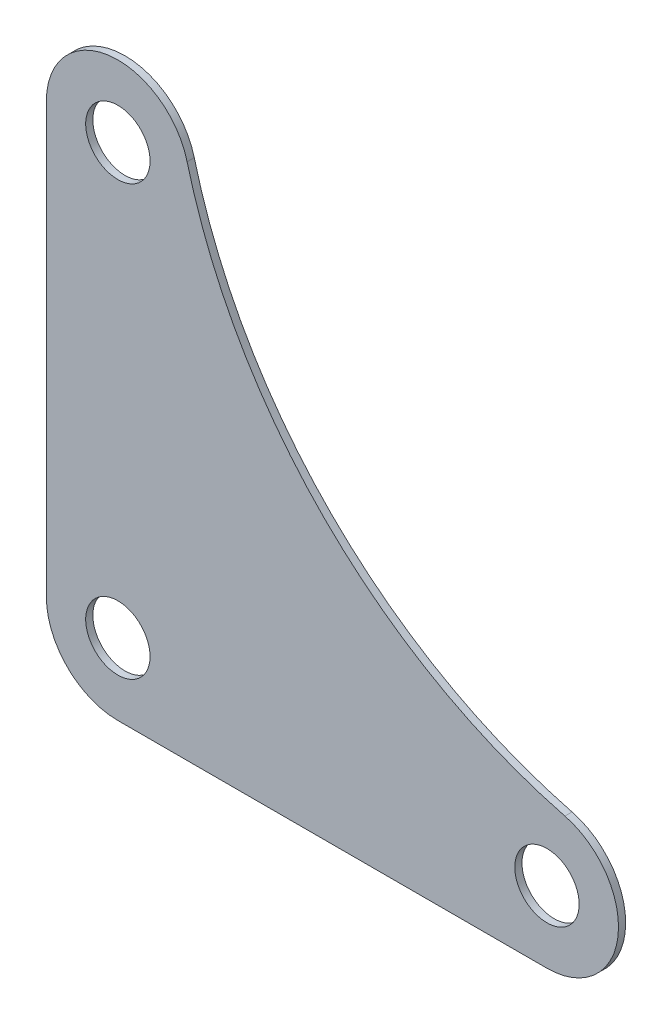
ISO-10303-21;
HEADER;
FILE_DESCRIPTION(('STEP AP214'),'2;1');
FILE_NAME('part.step','',(''),(''),'','','');
FILE_SCHEMA(('AUTOMOTIVE_DESIGN { 1 0 10303 214 1 1 1 1 }'));
ENDSEC;
DATA;
#1=APPLICATION_CONTEXT('core data for automotive mechanical design processes');
#2=APPLICATION_PROTOCOL_DEFINITION('international standard','automotive_design',2000,#1);
#3=PRODUCT_CONTEXT('',#1,'mechanical');
#4=PRODUCT('Part','Part','',(#3));
#5=PRODUCT_RELATED_PRODUCT_CATEGORY('part','',(#4));
#6=PRODUCT_DEFINITION_FORMATION('','',#4);
#7=PRODUCT_DEFINITION_CONTEXT('part definition',#1,'design');
#8=PRODUCT_DEFINITION('design','',#6,#7);
#9=PRODUCT_DEFINITION_SHAPE('','',#8);
#10=(LENGTH_UNIT() NAMED_UNIT(*) SI_UNIT(.MILLI.,.METRE.));
#11=(NAMED_UNIT(*) PLANE_ANGLE_UNIT() SI_UNIT($,.RADIAN.));
#12=(NAMED_UNIT(*) SI_UNIT($,.STERADIAN.) SOLID_ANGLE_UNIT());
#13=UNCERTAINTY_MEASURE_WITH_UNIT(LENGTH_MEASURE(1.E-05),#10,'distance_accuracy_value','');
#14=(GEOMETRIC_REPRESENTATION_CONTEXT(3) GLOBAL_UNCERTAINTY_ASSIGNED_CONTEXT((#13)) GLOBAL_UNIT_ASSIGNED_CONTEXT((#10,
#11,#12)) REPRESENTATION_CONTEXT('',''));
#15=CARTESIAN_POINT('',(0.,0.,0.));
#16=DIRECTION('',(0.,0.,1.));
#17=DIRECTION('',(1.,0.,0.));
#18=AXIS2_PLACEMENT_3D('',#15,#16,#17);
#19=CARTESIAN_POINT('',(0.,0.,1.));
#20=DIRECTION('',(1.,0.,0.));
#21=DIRECTION('',(0.,0.,-1.));
#22=AXIS2_PLACEMENT_3D('',#19,#20,#21);
#23=PLANE('',#22);
#24=DIRECTION('',(0.,-1.,0.));
#25=VECTOR('',#24,1.);
#26=CARTESIAN_POINT('',(0.,0.,0.));
#27=LINE('',#26,#25);
#28=CARTESIAN_POINT('',(0.,70.,0.));
#29=VERTEX_POINT('',#28);
#30=CARTESIAN_POINT('',(0.,10.,0.));
#31=VERTEX_POINT('',#30);
#32=EDGE_CURVE('E133',#29,#31,#27,.T.);
#33=ORIENTED_EDGE('',*,*,#32,.T.);
#34=DIRECTION('',(0.,0.,-1.));
#35=VECTOR('',#34,1.);
#36=CARTESIAN_POINT('',(0.,10.,1.));
#37=LINE('',#36,#35);
#38=CARTESIAN_POINT('',(0.,10.,1.));
#39=VERTEX_POINT('',#38);
#40=EDGE_CURVE('E51',#31,#39,#37,.F.);
#41=ORIENTED_EDGE('',*,*,#40,.T.);
#42=DIRECTION('',(0.,-1.,0.));
#43=VECTOR('',#42,1.);
#44=CARTESIAN_POINT('',(0.,0.,1.));
#45=LINE('',#44,#43);
#46=CARTESIAN_POINT('',(0.,70.,1.));
#47=VERTEX_POINT('',#46);
#48=EDGE_CURVE('E107',#47,#39,#45,.T.);
#49=ORIENTED_EDGE('',*,*,#48,.F.);
#50=DIRECTION('',(0.,0.,-1.));
#51=VECTOR('',#50,1.);
#52=CARTESIAN_POINT('',(0.,70.,1.));
#53=LINE('',#52,#51);
#54=EDGE_CURVE('E132',#47,#29,#53,.T.);
#55=ORIENTED_EDGE('',*,*,#54,.T.);
#56=EDGE_LOOP('',(#33,#41,#49,#55));
#57=FACE_BOUND('',#56,.T.);
#58=ADVANCED_FACE('F41',(#57),#23,.F.);
#59=CARTESIAN_POINT('',(0.,0.,1.));
#60=DIRECTION('',(0.,1.,0.));
#61=DIRECTION('',(0.,0.,1.));
#62=AXIS2_PLACEMENT_3D('',#59,#60,#61);
#63=PLANE('',#62);
#64=DIRECTION('',(1.,0.,0.));
#65=VECTOR('',#64,1.);
#66=CARTESIAN_POINT('',(0.,0.,1.));
#67=LINE('',#66,#65);
#68=CARTESIAN_POINT('',(10.,0.,1.));
#69=VERTEX_POINT('',#68);
#70=CARTESIAN_POINT('',(70.,0.,1.));
#71=VERTEX_POINT('',#70);
#72=EDGE_CURVE('E96',#69,#71,#67,.T.);
#73=ORIENTED_EDGE('',*,*,#72,.F.);
#74=DIRECTION('',(0.,0.,-1.));
#75=VECTOR('',#74,1.);
#76=CARTESIAN_POINT('',(10.,0.,1.));
#77=LINE('',#76,#75);
#78=CARTESIAN_POINT('',(10.,0.,0.));
#79=VERTEX_POINT('',#78);
#80=EDGE_CURVE('E116',#69,#79,#77,.T.);
#81=ORIENTED_EDGE('',*,*,#80,.T.);
#82=DIRECTION('',(1.,0.,0.));
#83=VECTOR('',#82,1.);
#84=CARTESIAN_POINT('',(0.,0.,0.));
#85=LINE('',#84,#83);
#86=CARTESIAN_POINT('',(70.,0.,0.));
#87=VERTEX_POINT('',#86);
#88=EDGE_CURVE('E112',#79,#87,#85,.T.);
#89=ORIENTED_EDGE('',*,*,#88,.T.);
#90=DIRECTION('',(0.,0.,-1.));
#91=VECTOR('',#90,1.);
#92=CARTESIAN_POINT('',(70.,0.,1.));
#93=LINE('',#92,#91);
#94=EDGE_CURVE('E110',#71,#87,#93,.T.);
#95=ORIENTED_EDGE('',*,*,#94,.F.);
#96=EDGE_LOOP('',(#73,#81,#89,#95));
#97=FACE_BOUND('',#96,.T.);
#98=ADVANCED_FACE('F111',(#97),#63,.F.);
#99=CARTESIAN_POINT('',(70.,10.,1.));
#100=DIRECTION('',(0.,0.,-1.));
#101=DIRECTION('',(-1.,0.,0.));
#102=AXIS2_PLACEMENT_3D('',#99,#100,#101);
#103=CYLINDRICAL_SURFACE('',#102,10.);
#104=CARTESIAN_POINT('',(70.,10.,0.));
#105=DIRECTION('',(0.,0.,1.));
#106=DIRECTION('',(1.,0.,0.));
#107=AXIS2_PLACEMENT_3D('',#104,#105,#106);
#108=CIRCLE('',#107,10.);
#109=CARTESIAN_POINT('',(72.5030454099815,19.6816715331378,0.));
#110=VERTEX_POINT('',#109);
#111=EDGE_CURVE('E138',#87,#110,#108,.T.);
#112=ORIENTED_EDGE('',*,*,#111,.T.);
#113=DIRECTION('',(0.,0.,-1.));
#114=VECTOR('',#113,1.);
#115=CARTESIAN_POINT('',(72.5030454099815,19.6816715331378,1.));
#116=LINE('',#115,#114);
#117=CARTESIAN_POINT('',(72.5030454099815,19.6816715331378,1.));
#118=VERTEX_POINT('',#117);
#119=EDGE_CURVE('E117',#118,#110,#116,.T.);
#120=ORIENTED_EDGE('',*,*,#119,.F.);
#121=CARTESIAN_POINT('',(70.,10.,1.));
#122=DIRECTION('',(0.,0.,1.));
#123=DIRECTION('',(1.,0.,0.));
#124=AXIS2_PLACEMENT_3D('',#121,#122,#123);
#125=CIRCLE('',#124,10.);
#126=EDGE_CURVE('E100',#71,#118,#125,.T.);
#127=ORIENTED_EDGE('',*,*,#126,.F.);
#128=ORIENTED_EDGE('',*,*,#94,.T.);
#129=EDGE_LOOP('',(#112,#120,#127,#128));
#130=FACE_BOUND('',#129,.T.);
#131=ADVANCED_FACE('F119',(#130),#103,.T.);
#132=CARTESIAN_POINT('',(90.9208171622762,90.9208171622762,1.));
#133=DIRECTION('',(0.,0.,-1.));
#134=DIRECTION('',(-1.,0.,0.));
#135=AXIS2_PLACEMENT_3D('',#132,#133,#134);
#136=CYLINDRICAL_SURFACE('',#135,73.5814527329354);
#137=CARTESIAN_POINT('',(90.9208171622762,90.9208171622762,0.));
#138=DIRECTION('',(0.,0.,-1.));
#139=DIRECTION('',(1.,0.,0.));
#140=AXIS2_PLACEMENT_3D('',#137,#138,#139);
#141=CIRCLE('',#140,73.5814527329354);
#142=CARTESIAN_POINT('',(19.6816715331378,72.5030454099815,0.));
#143=VERTEX_POINT('',#142);
#144=EDGE_CURVE('E141',#110,#143,#141,.T.);
#145=ORIENTED_EDGE('',*,*,#144,.T.);
#146=DIRECTION('',(0.,0.,-1.));
#147=VECTOR('',#146,1.);
#148=CARTESIAN_POINT('',(19.6816715331378,72.5030454099815,1.));
#149=LINE('',#148,#147);
#150=CARTESIAN_POINT('',(19.6816715331378,72.5030454099815,1.));
#151=VERTEX_POINT('',#150);
#152=EDGE_CURVE('E150',#151,#143,#149,.T.);
#153=ORIENTED_EDGE('',*,*,#152,.F.);
#154=CARTESIAN_POINT('',(90.9208171622762,90.9208171622762,1.));
#155=DIRECTION('',(0.,0.,-1.));
#156=DIRECTION('',(1.,0.,0.));
#157=AXIS2_PLACEMENT_3D('',#154,#155,#156);
#158=CIRCLE('',#157,73.5814527329354);
#159=EDGE_CURVE('E123',#118,#151,#158,.T.);
#160=ORIENTED_EDGE('',*,*,#159,.F.);
#161=ORIENTED_EDGE('',*,*,#119,.T.);
#162=EDGE_LOOP('',(#145,#153,#160,#161));
#163=FACE_BOUND('',#162,.T.);
#164=ADVANCED_FACE('F198',(#163),#136,.F.);
#165=CARTESIAN_POINT('',(10.,70.,1.));
#166=DIRECTION('',(0.,0.,-1.));
#167=DIRECTION('',(-1.,0.,0.));
#168=AXIS2_PLACEMENT_3D('',#165,#166,#167);
#169=CYLINDRICAL_SURFACE('',#168,10.);
#170=CARTESIAN_POINT('',(10.,70.,0.));
#171=DIRECTION('',(0.,0.,1.));
#172=DIRECTION('',(1.,0.,0.));
#173=AXIS2_PLACEMENT_3D('',#170,#171,#172);
#174=CIRCLE('',#173,10.);
#175=EDGE_CURVE('E144',#143,#29,#174,.T.);
#176=ORIENTED_EDGE('',*,*,#175,.T.);
#177=ORIENTED_EDGE('',*,*,#54,.F.);
#178=CARTESIAN_POINT('',(10.,70.,1.));
#179=DIRECTION('',(0.,0.,1.));
#180=DIRECTION('',(1.,0.,0.));
#181=AXIS2_PLACEMENT_3D('',#178,#179,#180);
#182=CIRCLE('',#181,10.);
#183=EDGE_CURVE('E126',#151,#47,#182,.T.);
#184=ORIENTED_EDGE('',*,*,#183,.F.);
#185=ORIENTED_EDGE('',*,*,#152,.T.);
#186=EDGE_LOOP('',(#176,#177,#184,#185));
#187=FACE_BOUND('',#186,.T.);
#188=ADVANCED_FACE('F201',(#187),#169,.T.);
#189=CARTESIAN_POINT('',(10.,70.,1.));
#190=DIRECTION('',(0.,0.,1.));
#191=DIRECTION('',(1.,0.,0.));
#192=AXIS2_PLACEMENT_3D('',#189,#190,#191);
#193=PLANE('',#192);
#194=CARTESIAN_POINT('',(10.,70.,1.));
#195=DIRECTION('',(0.,0.,1.));
#196=DIRECTION('',(1.,0.,0.));
#197=AXIS2_PLACEMENT_3D('',#194,#195,#196);
#198=CIRCLE('',#197,4.5);
#199=CARTESIAN_POINT('',(14.5,70.,1.));
#200=VERTEX_POINT('',#199);
#201=EDGE_CURVE('E231',#200,#200,#198,.T.);
#202=ORIENTED_EDGE('',*,*,#201,.F.);
#203=EDGE_LOOP('',(#202));
#204=FACE_BOUND('',#203,.T.);
#205=CARTESIAN_POINT('',(70.,10.,1.));
#206=DIRECTION('',(0.,0.,1.));
#207=DIRECTION('',(1.,0.,0.));
#208=AXIS2_PLACEMENT_3D('',#205,#206,#207);
#209=CIRCLE('',#208,4.5);
#210=CARTESIAN_POINT('',(74.5,10.,1.));
#211=VERTEX_POINT('',#210);
#212=EDGE_CURVE('E230',#211,#211,#209,.T.);
#213=ORIENTED_EDGE('',*,*,#212,.F.);
#214=EDGE_LOOP('',(#213));
#215=FACE_BOUND('',#214,.T.);
#216=CARTESIAN_POINT('',(10.,10.,1.));
#217=DIRECTION('',(0.,0.,1.));
#218=DIRECTION('',(1.,0.,0.));
#219=AXIS2_PLACEMENT_3D('',#216,#217,#218);
#220=CIRCLE('',#219,4.5);
#221=CARTESIAN_POINT('',(14.5,10.,1.));
#222=VERTEX_POINT('',#221);
#223=EDGE_CURVE('E166',#222,#222,#220,.T.);
#224=ORIENTED_EDGE('',*,*,#223,.F.);
#225=EDGE_LOOP('',(#224));
#226=FACE_BOUND('',#225,.T.);
#227=ORIENTED_EDGE('',*,*,#48,.T.);
#228=CARTESIAN_POINT('',(10.,10.,1.));
#229=DIRECTION('',(0.,0.,1.));
#230=DIRECTION('',(1.,0.,0.));
#231=AXIS2_PLACEMENT_3D('',#228,#229,#230);
#232=CIRCLE('',#231,10.);
#233=EDGE_CURVE('E11',#39,#69,#232,.T.);
#234=ORIENTED_EDGE('',*,*,#233,.T.);
#235=ORIENTED_EDGE('',*,*,#72,.T.);
#236=ORIENTED_EDGE('',*,*,#126,.T.);
#237=ORIENTED_EDGE('',*,*,#159,.T.);
#238=ORIENTED_EDGE('',*,*,#183,.T.);
#239=EDGE_LOOP('',(#227,#234,#235,#236,#237,#238));
#240=FACE_BOUND('',#239,.T.);
#241=ADVANCED_FACE('F98',(#204,#215,#226,#240),#193,.T.);
#242=CARTESIAN_POINT('',(10.,70.,0.));
#243=DIRECTION('',(0.,0.,1.));
#244=DIRECTION('',(1.,0.,0.));
#245=AXIS2_PLACEMENT_3D('',#242,#243,#244);
#246=PLANE('',#245);
#247=CARTESIAN_POINT('',(10.,70.,0.));
#248=DIRECTION('',(0.,0.,1.));
#249=DIRECTION('',(1.,0.,0.));
#250=AXIS2_PLACEMENT_3D('',#247,#248,#249);
#251=CIRCLE('',#250,4.5);
#252=CARTESIAN_POINT('',(14.5,70.,0.));
#253=VERTEX_POINT('',#252);
#254=EDGE_CURVE('E45',#253,#253,#251,.T.);
#255=ORIENTED_EDGE('',*,*,#254,.T.);
#256=EDGE_LOOP('',(#255));
#257=FACE_BOUND('',#256,.T.);
#258=CARTESIAN_POINT('',(70.,10.,0.));
#259=DIRECTION('',(0.,0.,1.));
#260=DIRECTION('',(1.,0.,0.));
#261=AXIS2_PLACEMENT_3D('',#258,#259,#260);
#262=CIRCLE('',#261,4.5);
#263=CARTESIAN_POINT('',(74.5,10.,0.));
#264=VERTEX_POINT('',#263);
#265=EDGE_CURVE('E165',#264,#264,#262,.T.);
#266=ORIENTED_EDGE('',*,*,#265,.T.);
#267=EDGE_LOOP('',(#266));
#268=FACE_BOUND('',#267,.T.);
#269=CARTESIAN_POINT('',(10.,10.,0.));
#270=DIRECTION('',(0.,0.,1.));
#271=DIRECTION('',(1.,0.,0.));
#272=AXIS2_PLACEMENT_3D('',#269,#270,#271);
#273=CIRCLE('',#272,4.5);
#274=CARTESIAN_POINT('',(14.5,10.,0.));
#275=VERTEX_POINT('',#274);
#276=EDGE_CURVE('E162',#275,#275,#273,.T.);
#277=ORIENTED_EDGE('',*,*,#276,.T.);
#278=EDGE_LOOP('',(#277));
#279=FACE_BOUND('',#278,.T.);
#280=ORIENTED_EDGE('',*,*,#88,.F.);
#281=CARTESIAN_POINT('',(10.,10.,0.));
#282=DIRECTION('',(0.,0.,1.));
#283=DIRECTION('',(1.,0.,0.));
#284=AXIS2_PLACEMENT_3D('',#281,#282,#283);
#285=CIRCLE('',#284,10.);
#286=EDGE_CURVE('E66',#79,#31,#285,.F.);
#287=ORIENTED_EDGE('',*,*,#286,.T.);
#288=ORIENTED_EDGE('',*,*,#32,.F.);
#289=ORIENTED_EDGE('',*,*,#175,.F.);
#290=ORIENTED_EDGE('',*,*,#144,.F.);
#291=ORIENTED_EDGE('',*,*,#111,.F.);
#292=EDGE_LOOP('',(#280,#287,#288,#289,#290,#291));
#293=FACE_BOUND('',#292,.T.);
#294=ADVANCED_FACE('F175',(#257,#268,#279,#293),#246,.F.);
#295=CARTESIAN_POINT('',(10.,10.,1.));
#296=DIRECTION('',(0.,0.,-1.));
#297=DIRECTION('',(-1.,0.,0.));
#298=AXIS2_PLACEMENT_3D('',#295,#296,#297);
#299=CYLINDRICAL_SURFACE('',#298,10.);
#300=ORIENTED_EDGE('',*,*,#233,.F.);
#301=ORIENTED_EDGE('',*,*,#40,.F.);
#302=ORIENTED_EDGE('',*,*,#286,.F.);
#303=ORIENTED_EDGE('',*,*,#80,.F.);
#304=EDGE_LOOP('',(#300,#301,#302,#303));
#305=FACE_BOUND('',#304,.T.);
#306=ADVANCED_FACE('F43',(#305),#299,.T.);
#307=CARTESIAN_POINT('',(10.,10.,-9.));
#308=DIRECTION('',(0.,0.,1.));
#309=DIRECTION('',(1.,0.,0.));
#310=AXIS2_PLACEMENT_3D('',#307,#308,#309);
#311=CYLINDRICAL_SURFACE('',#310,4.5);
#312=ORIENTED_EDGE('',*,*,#223,.T.);
#313=EDGE_LOOP('',(#312));
#314=FACE_BOUND('',#313,.T.);
#315=ORIENTED_EDGE('',*,*,#276,.F.);
#316=EDGE_LOOP('',(#315));
#317=FACE_BOUND('',#316,.T.);
#318=ADVANCED_FACE('F185',(#314,#317),#311,.F.);
#319=CARTESIAN_POINT('',(70.,10.,-9.));
#320=DIRECTION('',(0.,0.,1.));
#321=DIRECTION('',(1.,0.,0.));
#322=AXIS2_PLACEMENT_3D('',#319,#320,#321);
#323=CYLINDRICAL_SURFACE('',#322,4.5);
#324=ORIENTED_EDGE('',*,*,#212,.T.);
#325=EDGE_LOOP('',(#324));
#326=FACE_BOUND('',#325,.T.);
#327=ORIENTED_EDGE('',*,*,#265,.F.);
#328=EDGE_LOOP('',(#327));
#329=FACE_BOUND('',#328,.T.);
#330=ADVANCED_FACE('F179',(#326,#329),#323,.F.);
#331=CARTESIAN_POINT('',(10.,70.,-9.));
#332=DIRECTION('',(0.,0.,1.));
#333=DIRECTION('',(1.,0.,0.));
#334=AXIS2_PLACEMENT_3D('',#331,#332,#333);
#335=CYLINDRICAL_SURFACE('',#334,4.5);
#336=ORIENTED_EDGE('',*,*,#201,.T.);
#337=EDGE_LOOP('',(#336));
#338=FACE_BOUND('',#337,.T.);
#339=ORIENTED_EDGE('',*,*,#254,.F.);
#340=EDGE_LOOP('',(#339));
#341=FACE_BOUND('',#340,.T.);
#342=ADVANCED_FACE('F177',(#338,#341),#335,.F.);
#343=CLOSED_SHELL('',(#58,#98,#131,#164,#188,#241,#294,#306,#318,#330,#342));
#344=MANIFOLD_SOLID_BREP('B2',#343);
#345=ADVANCED_BREP_SHAPE_REPRESENTATION('',(#18,#344),#14);
#346=SHAPE_DEFINITION_REPRESENTATION(#9,#345);
ENDSEC;
END-ISO-10303-21;
